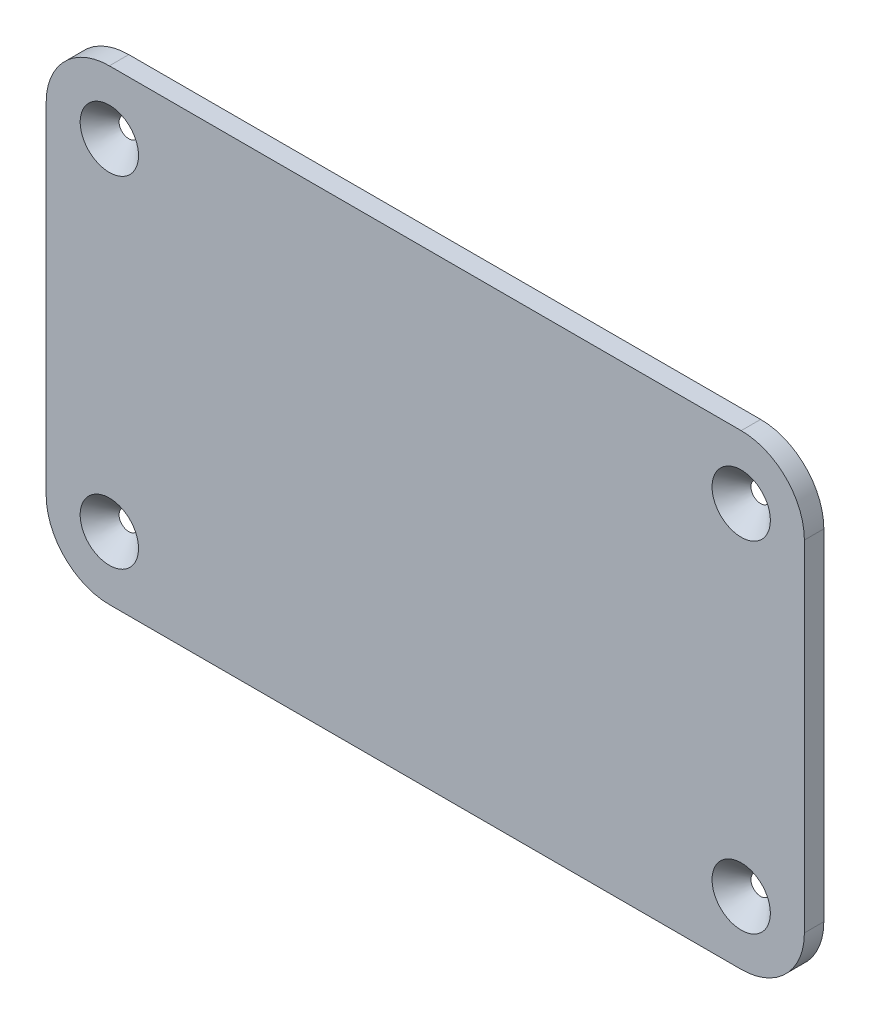
ISO-10303-21;
HEADER;
FILE_DESCRIPTION(('STEP AP214'),'2;1');
FILE_NAME('part.step','',(''),(''),'','','');
FILE_SCHEMA(('AUTOMOTIVE_DESIGN { 1 0 10303 214 1 1 1 1 }'));
ENDSEC;
DATA;
#1=APPLICATION_CONTEXT('core data for automotive mechanical design processes');
#2=APPLICATION_PROTOCOL_DEFINITION('international standard','automotive_design',2000,#1);
#3=PRODUCT_CONTEXT('',#1,'mechanical');
#4=PRODUCT('Part','Part','',(#3));
#5=PRODUCT_RELATED_PRODUCT_CATEGORY('part','',(#4));
#6=PRODUCT_DEFINITION_FORMATION('','',#4);
#7=PRODUCT_DEFINITION_CONTEXT('part definition',#1,'design');
#8=PRODUCT_DEFINITION('design','',#6,#7);
#9=PRODUCT_DEFINITION_SHAPE('','',#8);
#10=(LENGTH_UNIT() NAMED_UNIT(*) SI_UNIT(.MILLI.,.METRE.));
#11=(NAMED_UNIT(*) PLANE_ANGLE_UNIT() SI_UNIT($,.RADIAN.));
#12=(NAMED_UNIT(*) SI_UNIT($,.STERADIAN.) SOLID_ANGLE_UNIT());
#13=UNCERTAINTY_MEASURE_WITH_UNIT(LENGTH_MEASURE(1.E-05),#10,'distance_accuracy_value','');
#14=(GEOMETRIC_REPRESENTATION_CONTEXT(3) GLOBAL_UNCERTAINTY_ASSIGNED_CONTEXT((#13)) GLOBAL_UNIT_ASSIGNED_CONTEXT((#10,
#11,#12)) REPRESENTATION_CONTEXT('',''));
#15=CARTESIAN_POINT('',(0.,0.,0.));
#16=DIRECTION('',(0.,0.,1.));
#17=DIRECTION('',(1.,0.,0.));
#18=AXIS2_PLACEMENT_3D('',#15,#16,#17);
#19=CARTESIAN_POINT('',(0.,0.,4.));
#20=DIRECTION('',(0.,0.,1.));
#21=DIRECTION('',(1.,0.,0.));
#22=AXIS2_PLACEMENT_3D('',#19,#20,#21);
#23=PLANE('',#22);
#24=CARTESIAN_POINT('',(-32.5,17.5,4.));
#25=DIRECTION('',(0.,0.,1.));
#26=DIRECTION('',(1.,0.,0.));
#27=AXIS2_PLACEMENT_3D('',#24,#25,#26);
#28=CIRCLE('',#27,3.);
#29=CARTESIAN_POINT('',(-29.5,17.5,4.));
#30=VERTEX_POINT('',#29);
#31=EDGE_CURVE('E199',#30,#30,#28,.T.);
#32=ORIENTED_EDGE('',*,*,#31,.F.);
#33=EDGE_LOOP('',(#32));
#34=FACE_BOUND('',#33,.T.);
#35=CARTESIAN_POINT('',(-32.5,-17.5,4.));
#36=DIRECTION('',(0.,0.,1.));
#37=DIRECTION('',(1.,0.,0.));
#38=AXIS2_PLACEMENT_3D('',#35,#36,#37);
#39=CIRCLE('',#38,3.);
#40=CARTESIAN_POINT('',(-29.5,-17.5,4.));
#41=VERTEX_POINT('',#40);
#42=EDGE_CURVE('E203',#41,#41,#39,.T.);
#43=ORIENTED_EDGE('',*,*,#42,.F.);
#44=EDGE_LOOP('',(#43));
#45=FACE_BOUND('',#44,.T.);
#46=CARTESIAN_POINT('',(32.5,17.5,4.));
#47=DIRECTION('',(0.,0.,1.));
#48=DIRECTION('',(1.,0.,0.));
#49=AXIS2_PLACEMENT_3D('',#46,#47,#48);
#50=CIRCLE('',#49,3.);
#51=CARTESIAN_POINT('',(35.5,17.5,4.));
#52=VERTEX_POINT('',#51);
#53=EDGE_CURVE('E207',#52,#52,#50,.T.);
#54=ORIENTED_EDGE('',*,*,#53,.F.);
#55=EDGE_LOOP('',(#54));
#56=FACE_BOUND('',#55,.T.);
#57=CARTESIAN_POINT('',(32.5,-17.5,4.));
#58=DIRECTION('',(0.,0.,1.));
#59=DIRECTION('',(1.,0.,0.));
#60=AXIS2_PLACEMENT_3D('',#57,#58,#59);
#61=CIRCLE('',#60,3.);
#62=CARTESIAN_POINT('',(35.5,-17.5,4.));
#63=VERTEX_POINT('',#62);
#64=EDGE_CURVE('E210',#63,#63,#61,.T.);
#65=ORIENTED_EDGE('',*,*,#64,.F.);
#66=EDGE_LOOP('',(#65));
#67=FACE_BOUND('',#66,.T.);
#68=DIRECTION('',(1.,0.,0.));
#69=VECTOR('',#68,1.);
#70=CARTESIAN_POINT('',(-400000.,24.0000000000009,4.));
#71=LINE('',#70,#69);
#72=CARTESIAN_POINT('',(-32.5000000000273,24.0000000000009,4.));
#73=VERTEX_POINT('',#72);
#74=CARTESIAN_POINT('',(32.5000000000273,24.0000000000009,4.));
#75=VERTEX_POINT('',#74);
#76=EDGE_CURVE('E99',#73,#75,#71,.T.);
#77=ORIENTED_EDGE('',*,*,#76,.F.);
#78=CARTESIAN_POINT('',(-32.5,17.5,4.));
#79=DIRECTION('',(0.,0.,1.));
#80=DIRECTION('',(1.,0.,0.));
#81=AXIS2_PLACEMENT_3D('',#78,#79,#80);
#82=CIRCLE('',#81,6.5);
#83=CARTESIAN_POINT('',(-38.9999999999882,17.5000000000409,4.));
#84=VERTEX_POINT('',#83);
#85=EDGE_CURVE('E121',#73,#84,#82,.T.);
#86=ORIENTED_EDGE('',*,*,#85,.T.);
#87=DIRECTION('',(0.,1.,0.));
#88=VECTOR('',#87,1.);
#89=CARTESIAN_POINT('',(-38.9999999999304,-291545.,4.));
#90=LINE('',#89,#88);
#91=CARTESIAN_POINT('',(-39.,-17.4999999999841,4.));
#92=VERTEX_POINT('',#91);
#93=EDGE_CURVE('E125',#92,#84,#90,.T.);
#94=ORIENTED_EDGE('',*,*,#93,.F.);
#95=CARTESIAN_POINT('',(-32.5,-17.5,4.));
#96=DIRECTION('',(0.,0.,1.));
#97=DIRECTION('',(1.,0.,0.));
#98=AXIS2_PLACEMENT_3D('',#95,#96,#97);
#99=CIRCLE('',#98,6.5);
#100=CARTESIAN_POINT('',(-32.5000000000273,-23.9999999999937,4.));
#101=VERTEX_POINT('',#100);
#102=EDGE_CURVE('E123',#92,#101,#99,.T.);
#103=ORIENTED_EDGE('',*,*,#102,.T.);
#104=DIRECTION('',(-1.,0.,0.));
#105=VECTOR('',#104,1.);
#106=CARTESIAN_POINT('',(-400000.,-24.0000000000578,4.));
#107=LINE('',#106,#105);
#108=CARTESIAN_POINT('',(32.5000000000273,-24.,4.));
#109=VERTEX_POINT('',#108);
#110=EDGE_CURVE('E131',#109,#101,#107,.T.);
#111=ORIENTED_EDGE('',*,*,#110,.F.);
#112=CARTESIAN_POINT('',(32.5,-17.5,4.));
#113=DIRECTION('',(0.,0.,1.));
#114=DIRECTION('',(1.,0.,0.));
#115=AXIS2_PLACEMENT_3D('',#112,#113,#114);
#116=CIRCLE('',#115,6.5);
#117=CARTESIAN_POINT('',(38.9999999999854,-17.4999999999841,4.));
#118=VERTEX_POINT('',#117);
#119=EDGE_CURVE('E102',#109,#118,#116,.T.);
#120=ORIENTED_EDGE('',*,*,#119,.T.);
#121=DIRECTION('',(0.,-1.,0.));
#122=VECTOR('',#121,1.);
#123=CARTESIAN_POINT('',(39.000000000101,-291545.,4.));
#124=LINE('',#123,#122);
#125=CARTESIAN_POINT('',(39.,17.5,4.));
#126=VERTEX_POINT('',#125);
#127=EDGE_CURVE('E92',#126,#118,#124,.T.);
#128=ORIENTED_EDGE('',*,*,#127,.F.);
#129=CARTESIAN_POINT('',(32.5,17.5,4.));
#130=DIRECTION('',(0.,0.,1.));
#131=DIRECTION('',(1.,0.,0.));
#132=AXIS2_PLACEMENT_3D('',#129,#130,#131);
#133=CIRCLE('',#132,6.49999999999999);
#134=EDGE_CURVE('E96',#126,#75,#133,.T.);
#135=ORIENTED_EDGE('',*,*,#134,.T.);
#136=EDGE_LOOP('',(#77,#86,#94,#103,#111,#120,#128,#135));
#137=FACE_BOUND('',#136,.T.);
#138=ADVANCED_FACE('F32',(#34,#45,#56,#67,#137),#23,.T.);
#139=CARTESIAN_POINT('',(-32.5,17.5,2.));
#140=DIRECTION('',(0.,0.,1.));
#141=DIRECTION('',(1.,0.,0.));
#142=AXIS2_PLACEMENT_3D('',#139,#140,#141);
#143=PLANE('',#142);
#144=CARTESIAN_POINT('',(-32.5,17.5,2.));
#145=DIRECTION('',(0.,0.,1.));
#146=DIRECTION('',(1.,0.,0.));
#147=AXIS2_PLACEMENT_3D('',#144,#145,#146);
#148=CIRCLE('',#147,0.999999999999996);
#149=CARTESIAN_POINT('',(-31.5,17.5,2.));
#150=VERTEX_POINT('',#149);
#151=EDGE_CURVE('E219',#150,#150,#148,.T.);
#152=ORIENTED_EDGE('',*,*,#151,.T.);
#153=EDGE_LOOP('',(#152));
#154=FACE_BOUND('',#153,.T.);
#155=CARTESIAN_POINT('',(-32.5,-17.5,2.));
#156=DIRECTION('',(0.,0.,1.));
#157=DIRECTION('',(1.,0.,0.));
#158=AXIS2_PLACEMENT_3D('',#155,#156,#157);
#159=CIRCLE('',#158,0.999999999999996);
#160=CARTESIAN_POINT('',(-31.5,-17.5,2.));
#161=VERTEX_POINT('',#160);
#162=EDGE_CURVE('E35',#161,#161,#159,.T.);
#163=ORIENTED_EDGE('',*,*,#162,.T.);
#164=EDGE_LOOP('',(#163));
#165=FACE_BOUND('',#164,.T.);
#166=CARTESIAN_POINT('',(32.5,17.5,2.));
#167=DIRECTION('',(0.,0.,1.));
#168=DIRECTION('',(1.,0.,0.));
#169=AXIS2_PLACEMENT_3D('',#166,#167,#168);
#170=CIRCLE('',#169,0.999999999999996);
#171=CARTESIAN_POINT('',(33.5,17.5,2.));
#172=VERTEX_POINT('',#171);
#173=EDGE_CURVE('E211',#172,#172,#170,.T.);
#174=ORIENTED_EDGE('',*,*,#173,.T.);
#175=EDGE_LOOP('',(#174));
#176=FACE_BOUND('',#175,.T.);
#177=CARTESIAN_POINT('',(32.5,-17.5,2.));
#178=DIRECTION('',(0.,0.,1.));
#179=DIRECTION('',(1.,0.,0.));
#180=AXIS2_PLACEMENT_3D('',#177,#178,#179);
#181=CIRCLE('',#180,0.999999999999996);
#182=CARTESIAN_POINT('',(33.5,-17.5,2.));
#183=VERTEX_POINT('',#182);
#184=EDGE_CURVE('E124',#183,#183,#181,.T.);
#185=ORIENTED_EDGE('',*,*,#184,.T.);
#186=EDGE_LOOP('',(#185));
#187=FACE_BOUND('',#186,.T.);
#188=CARTESIAN_POINT('',(-32.5,17.5,2.));
#189=DIRECTION('',(0.,0.,1.));
#190=DIRECTION('',(1.,0.,0.));
#191=AXIS2_PLACEMENT_3D('',#188,#189,#190);
#192=CIRCLE('',#191,6.5);
#193=CARTESIAN_POINT('',(-32.5000000000273,24.0000000000009,2.));
#194=VERTEX_POINT('',#193);
#195=CARTESIAN_POINT('',(-38.9999999999882,17.5000000000409,2.));
#196=VERTEX_POINT('',#195);
#197=EDGE_CURVE('E11',#194,#196,#192,.T.);
#198=ORIENTED_EDGE('',*,*,#197,.F.);
#199=DIRECTION('',(1.,0.,0.));
#200=VECTOR('',#199,1.);
#201=CARTESIAN_POINT('',(-400000.,24.0000000000009,2.));
#202=LINE('',#201,#200);
#203=CARTESIAN_POINT('',(32.5000000000273,24.0000000000009,2.));
#204=VERTEX_POINT('',#203);
#205=EDGE_CURVE('E101',#194,#204,#202,.T.);
#206=ORIENTED_EDGE('',*,*,#205,.T.);
#207=CARTESIAN_POINT('',(32.5,17.5,2.));
#208=DIRECTION('',(0.,0.,1.));
#209=DIRECTION('',(1.,0.,0.));
#210=AXIS2_PLACEMENT_3D('',#207,#208,#209);
#211=CIRCLE('',#210,6.49999999999999);
#212=CARTESIAN_POINT('',(39.,17.4999999999841,2.));
#213=VERTEX_POINT('',#212);
#214=EDGE_CURVE('E108',#213,#204,#211,.T.);
#215=ORIENTED_EDGE('',*,*,#214,.F.);
#216=DIRECTION('',(0.,-1.,0.));
#217=VECTOR('',#216,1.);
#218=CARTESIAN_POINT('',(39.000000000101,-291545.,2.));
#219=LINE('',#218,#217);
#220=CARTESIAN_POINT('',(38.9999999999854,-17.4999999999841,2.));
#221=VERTEX_POINT('',#220);
#222=EDGE_CURVE('E150',#213,#221,#219,.T.);
#223=ORIENTED_EDGE('',*,*,#222,.T.);
#224=CARTESIAN_POINT('',(32.5,-17.5,2.));
#225=DIRECTION('',(0.,0.,1.));
#226=DIRECTION('',(1.,0.,0.));
#227=AXIS2_PLACEMENT_3D('',#224,#225,#226);
#228=CIRCLE('',#227,6.5);
#229=CARTESIAN_POINT('',(32.5000000000273,-24.,2.));
#230=VERTEX_POINT('',#229);
#231=EDGE_CURVE('E135',#230,#221,#228,.T.);
#232=ORIENTED_EDGE('',*,*,#231,.F.);
#233=DIRECTION('',(-1.,0.,0.));
#234=VECTOR('',#233,1.);
#235=CARTESIAN_POINT('',(-400000.,-24.0000000000578,2.));
#236=LINE('',#235,#234);
#237=CARTESIAN_POINT('',(-32.5000000000273,-23.9999999999937,2.));
#238=VERTEX_POINT('',#237);
#239=EDGE_CURVE('E118',#230,#238,#236,.T.);
#240=ORIENTED_EDGE('',*,*,#239,.T.);
#241=CARTESIAN_POINT('',(-32.5,-17.5,2.));
#242=DIRECTION('',(0.,0.,1.));
#243=DIRECTION('',(1.,0.,0.));
#244=AXIS2_PLACEMENT_3D('',#241,#242,#243);
#245=CIRCLE('',#244,6.5);
#246=CARTESIAN_POINT('',(-39.,-17.4999999999841,2.));
#247=VERTEX_POINT('',#246);
#248=EDGE_CURVE('E129',#247,#238,#245,.T.);
#249=ORIENTED_EDGE('',*,*,#248,.F.);
#250=DIRECTION('',(0.,1.,0.));
#251=VECTOR('',#250,1.);
#252=CARTESIAN_POINT('',(-38.9999999999304,-291545.,2.));
#253=LINE('',#252,#251);
#254=EDGE_CURVE('E115',#247,#196,#253,.T.);
#255=ORIENTED_EDGE('',*,*,#254,.T.);
#256=EDGE_LOOP('',(#198,#206,#215,#223,#232,#240,#249,#255));
#257=FACE_BOUND('',#256,.T.);
#258=ADVANCED_FACE('F168',(#154,#165,#176,#187,#257),#143,.F.);
#259=CARTESIAN_POINT('',(-400000.,24.0000000000009,95.586025134843));
#260=DIRECTION('',(0.,1.,0.));
#261=DIRECTION('',(0.,0.,1.));
#262=AXIS2_PLACEMENT_3D('',#259,#260,#261);
#263=PLANE('',#262);
#264=DIRECTION('',(0.,0.,-1.));
#265=VECTOR('',#264,1.);
#266=CARTESIAN_POINT('',(-32.5000000000273,24.0000000000009,95.586025134843));
#267=LINE('',#266,#265);
#268=EDGE_CURVE('E41',#73,#194,#267,.T.);
#269=ORIENTED_EDGE('',*,*,#268,.F.);
#270=ORIENTED_EDGE('',*,*,#76,.T.);
#271=DIRECTION('',(0.,0.,-1.));
#272=VECTOR('',#271,1.);
#273=CARTESIAN_POINT('',(32.5000000000273,24.0000000000009,95.586025134843));
#274=LINE('',#273,#272);
#275=EDGE_CURVE('E105',#75,#204,#274,.T.);
#276=ORIENTED_EDGE('',*,*,#275,.T.);
#277=ORIENTED_EDGE('',*,*,#205,.F.);
#278=EDGE_LOOP('',(#269,#270,#276,#277));
#279=FACE_BOUND('',#278,.T.);
#280=ADVANCED_FACE('F114',(#279),#263,.T.);
#281=CARTESIAN_POINT('',(32.5,17.5,95.586025134843));
#282=DIRECTION('',(0.,0.,-1.));
#283=DIRECTION('',(-1.,0.,0.));
#284=AXIS2_PLACEMENT_3D('',#281,#282,#283);
#285=CYLINDRICAL_SURFACE('',#284,6.49999999999999);
#286=ORIENTED_EDGE('',*,*,#134,.F.);
#287=DIRECTION('',(0.,0.,-1.));
#288=VECTOR('',#287,1.);
#289=CARTESIAN_POINT('',(39.,17.4999999999841,95.586025134843));
#290=LINE('',#289,#288);
#291=EDGE_CURVE('E112',#126,#213,#290,.T.);
#292=ORIENTED_EDGE('',*,*,#291,.T.);
#293=ORIENTED_EDGE('',*,*,#214,.T.);
#294=ORIENTED_EDGE('',*,*,#275,.F.);
#295=EDGE_LOOP('',(#286,#292,#293,#294));
#296=FACE_BOUND('',#295,.T.);
#297=ADVANCED_FACE('F106',(#296),#285,.T.);
#298=CARTESIAN_POINT('',(39.000000000101,-291545.,95.586025134843));
#299=DIRECTION('',(1.,0.,0.));
#300=DIRECTION('',(0.,1.,0.));
#301=AXIS2_PLACEMENT_3D('',#298,#299,#300);
#302=PLANE('',#301);
#303=ORIENTED_EDGE('',*,*,#291,.F.);
#304=ORIENTED_EDGE('',*,*,#127,.T.);
#305=DIRECTION('',(0.,0.,-1.));
#306=VECTOR('',#305,1.);
#307=CARTESIAN_POINT('',(38.9999999999854,-17.4999999999841,95.586025134843));
#308=LINE('',#307,#306);
#309=EDGE_CURVE('E137',#118,#221,#308,.T.);
#310=ORIENTED_EDGE('',*,*,#309,.T.);
#311=ORIENTED_EDGE('',*,*,#222,.F.);
#312=EDGE_LOOP('',(#303,#304,#310,#311));
#313=FACE_BOUND('',#312,.T.);
#314=ADVANCED_FACE('F273',(#313),#302,.T.);
#315=CARTESIAN_POINT('',(32.5,-17.5,95.586025134843));
#316=DIRECTION('',(0.,0.,-1.));
#317=DIRECTION('',(-1.,0.,0.));
#318=AXIS2_PLACEMENT_3D('',#315,#316,#317);
#319=CYLINDRICAL_SURFACE('',#318,6.5);
#320=ORIENTED_EDGE('',*,*,#119,.F.);
#321=DIRECTION('',(0.,0.,-1.));
#322=VECTOR('',#321,1.);
#323=CARTESIAN_POINT('',(32.5000000000273,-24.,95.586025134843));
#324=LINE('',#323,#322);
#325=EDGE_CURVE('E143',#109,#230,#324,.T.);
#326=ORIENTED_EDGE('',*,*,#325,.T.);
#327=ORIENTED_EDGE('',*,*,#231,.T.);
#328=ORIENTED_EDGE('',*,*,#309,.F.);
#329=EDGE_LOOP('',(#320,#326,#327,#328));
#330=FACE_BOUND('',#329,.T.);
#331=ADVANCED_FACE('F282',(#330),#319,.T.);
#332=CARTESIAN_POINT('',(-400000.,-24.0000000000578,95.586025134843));
#333=DIRECTION('',(0.,-1.,0.));
#334=DIRECTION('',(1.,0.,0.));
#335=AXIS2_PLACEMENT_3D('',#332,#333,#334);
#336=PLANE('',#335);
#337=ORIENTED_EDGE('',*,*,#325,.F.);
#338=ORIENTED_EDGE('',*,*,#110,.T.);
#339=DIRECTION('',(0.,0.,-1.));
#340=VECTOR('',#339,1.);
#341=CARTESIAN_POINT('',(-32.5000000000273,-23.9999999999937,95.586025134843));
#342=LINE('',#341,#340);
#343=EDGE_CURVE('E134',#101,#238,#342,.T.);
#344=ORIENTED_EDGE('',*,*,#343,.T.);
#345=ORIENTED_EDGE('',*,*,#239,.F.);
#346=EDGE_LOOP('',(#337,#338,#344,#345));
#347=FACE_BOUND('',#346,.T.);
#348=ADVANCED_FACE('F171',(#347),#336,.T.);
#349=CARTESIAN_POINT('',(-32.5,-17.5,95.586025134843));
#350=DIRECTION('',(0.,0.,-1.));
#351=DIRECTION('',(-1.,0.,0.));
#352=AXIS2_PLACEMENT_3D('',#349,#350,#351);
#353=CYLINDRICAL_SURFACE('',#352,6.5);
#354=ORIENTED_EDGE('',*,*,#102,.F.);
#355=DIRECTION('',(0.,0.,-1.));
#356=VECTOR('',#355,1.);
#357=CARTESIAN_POINT('',(-39.,-17.4999999999841,95.586025134843));
#358=LINE('',#357,#356);
#359=EDGE_CURVE('E140',#92,#247,#358,.T.);
#360=ORIENTED_EDGE('',*,*,#359,.T.);
#361=ORIENTED_EDGE('',*,*,#248,.T.);
#362=ORIENTED_EDGE('',*,*,#343,.F.);
#363=EDGE_LOOP('',(#354,#360,#361,#362));
#364=FACE_BOUND('',#363,.T.);
#365=ADVANCED_FACE('F162',(#364),#353,.T.);
#366=CARTESIAN_POINT('',(-38.9999999999304,-291545.,95.586025134843));
#367=DIRECTION('',(-1.,0.,0.));
#368=DIRECTION('',(0.,-1.,0.));
#369=AXIS2_PLACEMENT_3D('',#366,#367,#368);
#370=PLANE('',#369);
#371=ORIENTED_EDGE('',*,*,#359,.F.);
#372=ORIENTED_EDGE('',*,*,#93,.T.);
#373=DIRECTION('',(0.,0.,-1.));
#374=VECTOR('',#373,1.);
#375=CARTESIAN_POINT('',(-38.9999999999882,17.5000000000409,95.586025134843));
#376=LINE('',#375,#374);
#377=EDGE_CURVE('E128',#84,#196,#376,.T.);
#378=ORIENTED_EDGE('',*,*,#377,.T.);
#379=ORIENTED_EDGE('',*,*,#254,.F.);
#380=EDGE_LOOP('',(#371,#372,#378,#379));
#381=FACE_BOUND('',#380,.T.);
#382=ADVANCED_FACE('F176',(#381),#370,.T.);
#383=CARTESIAN_POINT('',(-32.5,17.5,95.586025134843));
#384=DIRECTION('',(0.,0.,-1.));
#385=DIRECTION('',(-1.,0.,0.));
#386=AXIS2_PLACEMENT_3D('',#383,#384,#385);
#387=CYLINDRICAL_SURFACE('',#386,6.5);
#388=ORIENTED_EDGE('',*,*,#85,.F.);
#389=ORIENTED_EDGE('',*,*,#268,.T.);
#390=ORIENTED_EDGE('',*,*,#197,.T.);
#391=ORIENTED_EDGE('',*,*,#377,.F.);
#392=EDGE_LOOP('',(#388,#389,#390,#391));
#393=FACE_BOUND('',#392,.T.);
#394=ADVANCED_FACE('F177',(#393),#387,.T.);
#395=CARTESIAN_POINT('',(32.5,-17.5,4.));
#396=DIRECTION('',(0.,0.,1.));
#397=DIRECTION('',(1.,0.,0.));
#398=AXIS2_PLACEMENT_3D('',#395,#396,#397);
#399=CONICAL_SURFACE('',#398,3.,0.78539816339745);
#400=CARTESIAN_POINT('',(35.5,-17.5,4.));
#401=CARTESIAN_POINT('',(35.4791666666667,-17.5,3.97916666666667));
#402=CARTESIAN_POINT('',(35.4583333333333,-17.5,3.95833333333333));
#403=CARTESIAN_POINT('',(35.4166666666667,-17.5,3.91666666666667));
#404=CARTESIAN_POINT('',(35.3958333333333,-17.5,3.89583333333333));
#405=CARTESIAN_POINT('',(35.3541666666667,-17.5,3.85416666666667));
#406=CARTESIAN_POINT('',(35.3333333333333,-17.5,3.83333333333333));
#407=CARTESIAN_POINT('',(35.2916666666667,-17.5,3.79166666666667));
#408=CARTESIAN_POINT('',(35.2708333333333,-17.5,3.77083333333333));
#409=CARTESIAN_POINT('',(35.2291666666667,-17.5,3.72916666666667));
#410=CARTESIAN_POINT('',(35.2083333333333,-17.5,3.70833333333333));
#411=CARTESIAN_POINT('',(35.1666666666667,-17.5,3.66666666666667));
#412=CARTESIAN_POINT('',(35.1458333333333,-17.5,3.64583333333333));
#413=CARTESIAN_POINT('',(35.1041666666667,-17.5,3.60416666666667));
#414=CARTESIAN_POINT('',(35.0833333333333,-17.5,3.58333333333333));
#415=CARTESIAN_POINT('',(35.0416666666667,-17.5,3.54166666666667));
#416=CARTESIAN_POINT('',(35.0208333333333,-17.5,3.52083333333333));
#417=CARTESIAN_POINT('',(34.9791666666667,-17.5,3.47916666666667));
#418=CARTESIAN_POINT('',(34.9583333333333,-17.5,3.45833333333333));
#419=CARTESIAN_POINT('',(34.9166666666667,-17.5,3.41666666666667));
#420=CARTESIAN_POINT('',(34.8958333333333,-17.5,3.39583333333333));
#421=CARTESIAN_POINT('',(34.8541666666667,-17.5,3.35416666666667));
#422=CARTESIAN_POINT('',(34.8333333333333,-17.5,3.33333333333333));
#423=CARTESIAN_POINT('',(34.7916666666667,-17.5,3.29166666666667));
#424=CARTESIAN_POINT('',(34.7708333333333,-17.5,3.27083333333333));
#425=CARTESIAN_POINT('',(34.7291666666667,-17.5,3.22916666666667));
#426=CARTESIAN_POINT('',(34.7083333333333,-17.5,3.20833333333333));
#427=CARTESIAN_POINT('',(34.6666666666667,-17.5,3.16666666666667));
#428=CARTESIAN_POINT('',(34.6458333333333,-17.5,3.14583333333333));
#429=CARTESIAN_POINT('',(34.6041666666667,-17.5,3.10416666666667));
#430=CARTESIAN_POINT('',(34.5833333333333,-17.5,3.08333333333333));
#431=CARTESIAN_POINT('',(34.5416666666667,-17.5,3.04166666666667));
#432=CARTESIAN_POINT('',(34.5208333333333,-17.5,3.02083333333333));
#433=CARTESIAN_POINT('',(34.4791666666667,-17.5,2.97916666666667));
#434=CARTESIAN_POINT('',(34.4583333333333,-17.5,2.95833333333333));
#435=CARTESIAN_POINT('',(34.4166666666667,-17.5,2.91666666666667));
#436=CARTESIAN_POINT('',(34.3958333333333,-17.5,2.89583333333333));
#437=CARTESIAN_POINT('',(34.3541666666667,-17.5,2.85416666666667));
#438=CARTESIAN_POINT('',(34.3333333333333,-17.5,2.83333333333333));
#439=CARTESIAN_POINT('',(34.2916666666667,-17.5,2.79166666666667));
#440=CARTESIAN_POINT('',(34.2708333333333,-17.5,2.77083333333333));
#441=CARTESIAN_POINT('',(34.2291666666667,-17.5,2.72916666666667));
#442=CARTESIAN_POINT('',(34.2083333333333,-17.5,2.70833333333333));
#443=CARTESIAN_POINT('',(34.1666666666667,-17.5,2.66666666666667));
#444=CARTESIAN_POINT('',(34.1458333333333,-17.5,2.64583333333333));
#445=CARTESIAN_POINT('',(34.1041666666667,-17.5,2.60416666666667));
#446=CARTESIAN_POINT('',(34.0833333333333,-17.5,2.58333333333333));
#447=CARTESIAN_POINT('',(34.0416666666667,-17.5,2.54166666666667));
#448=CARTESIAN_POINT('',(34.0208333333333,-17.5,2.52083333333333));
#449=CARTESIAN_POINT('',(33.9791666666667,-17.5,2.47916666666667));
#450=CARTESIAN_POINT('',(33.9583333333333,-17.5,2.45833333333333));
#451=CARTESIAN_POINT('',(33.9166666666667,-17.5,2.41666666666667));
#452=CARTESIAN_POINT('',(33.8958333333333,-17.5,2.39583333333333));
#453=CARTESIAN_POINT('',(33.8541666666667,-17.5,2.35416666666667));
#454=CARTESIAN_POINT('',(33.8333333333333,-17.5,2.33333333333333));
#455=CARTESIAN_POINT('',(33.7916666666667,-17.5,2.29166666666667));
#456=CARTESIAN_POINT('',(33.7708333333333,-17.5,2.27083333333333));
#457=CARTESIAN_POINT('',(33.7291666666667,-17.5,2.22916666666667));
#458=CARTESIAN_POINT('',(33.7083333333333,-17.5,2.20833333333333));
#459=CARTESIAN_POINT('',(33.6666666666667,-17.5,2.16666666666667));
#460=CARTESIAN_POINT('',(33.6458333333333,-17.5,2.14583333333333));
#461=CARTESIAN_POINT('',(33.6041666666667,-17.5,2.10416666666667));
#462=CARTESIAN_POINT('',(33.5833333333333,-17.5,2.08333333333333));
#463=CARTESIAN_POINT('',(33.5416666666667,-17.5,2.04166666666667));
#464=CARTESIAN_POINT('',(33.5208333333333,-17.5,2.02083333333333));
#465=CARTESIAN_POINT('',(33.5,-17.5,2.));
#466=B_SPLINE_CURVE_WITH_KNOTS('',3,(#400,#401,#402,#403,#404,#405,#406,#407,#408,#409,#410,
#411,#412,#413,#414,#415,#416,#417,#418,#419,#420,#421,#422,#423,#424,#425,#426,#427,#428,#429,
#430,#431,#432,#433,#434,#435,#436,#437,#438,#439,#440,#441,#442,#443,#444,#445,#446,#447,#448,
#449,#450,#451,#452,#453,#454,#455,#456,#457,#458,#459,#460,#461,#462,#463,#464,#465),
.UNSPECIFIED.,.F.,.F.,(4,2,2,2,2,2,2,2,2,2,2,2,2,2,2,2,2,2,2,2,2,2,2,2,2,2,2,2,2,2,2,2,4),(0.,
0.0883883476483185,0.176776695296637,0.265165042944956,0.353553390593274,0.441941738241593,
0.530330085889911,0.61871843353823,0.707106781186548,0.795495128834867,0.883883476483185,
0.972271824131504,1.06066017177982,1.14904851942814,1.23743686707646,1.32582521472478,
1.4142135623731,1.50260191002141,1.59099025766973,1.67937860531805,1.76776695296637,
1.85615530061469,1.94454364826301,2.03293199591133,2.12132034355965,2.20970869120797,
2.29809703885629,2.3864853865046,2.47487373415292,2.56326208180124,2.65165042944956,
2.74003877709788,2.8284271247462),.UNSPECIFIED.);
#467=EDGE_CURVE('BSEAM179',#63,#183,#466,.T.);
#468=ORIENTED_EDGE('',*,*,#64,.T.);
#469=ORIENTED_EDGE('',*,*,#184,.F.);
#470=ORIENTED_EDGE('',*,*,#467,.T.);
#471=ORIENTED_EDGE('',*,*,#467,.F.);
#472=EDGE_LOOP('',(#468,#470,#469,#471));
#473=FACE_BOUND('',#472,.T.);
#474=ADVANCED_FACE('F179',(#473),#399,.F.);
#475=CARTESIAN_POINT('',(32.5,17.5,4.));
#476=DIRECTION('',(0.,0.,1.));
#477=DIRECTION('',(1.,0.,0.));
#478=AXIS2_PLACEMENT_3D('',#475,#476,#477);
#479=CONICAL_SURFACE('',#478,3.,0.78539816339745);
#480=CARTESIAN_POINT('',(35.5,17.5,4.));
#481=CARTESIAN_POINT('',(35.4791666666667,17.5,3.97916666666667));
#482=CARTESIAN_POINT('',(35.4583333333333,17.5,3.95833333333333));
#483=CARTESIAN_POINT('',(35.4166666666667,17.5,3.91666666666667));
#484=CARTESIAN_POINT('',(35.3958333333333,17.5,3.89583333333333));
#485=CARTESIAN_POINT('',(35.3541666666667,17.5,3.85416666666667));
#486=CARTESIAN_POINT('',(35.3333333333333,17.5,3.83333333333333));
#487=CARTESIAN_POINT('',(35.2916666666667,17.5,3.79166666666667));
#488=CARTESIAN_POINT('',(35.2708333333333,17.5,3.77083333333333));
#489=CARTESIAN_POINT('',(35.2291666666667,17.5,3.72916666666667));
#490=CARTESIAN_POINT('',(35.2083333333333,17.5,3.70833333333333));
#491=CARTESIAN_POINT('',(35.1666666666667,17.5,3.66666666666667));
#492=CARTESIAN_POINT('',(35.1458333333333,17.5,3.64583333333333));
#493=CARTESIAN_POINT('',(35.1041666666667,17.5,3.60416666666667));
#494=CARTESIAN_POINT('',(35.0833333333333,17.5,3.58333333333333));
#495=CARTESIAN_POINT('',(35.0416666666667,17.5,3.54166666666667));
#496=CARTESIAN_POINT('',(35.0208333333333,17.5,3.52083333333333));
#497=CARTESIAN_POINT('',(34.9791666666667,17.5,3.47916666666667));
#498=CARTESIAN_POINT('',(34.9583333333333,17.5,3.45833333333333));
#499=CARTESIAN_POINT('',(34.9166666666667,17.5,3.41666666666667));
#500=CARTESIAN_POINT('',(34.8958333333333,17.5,3.39583333333333));
#501=CARTESIAN_POINT('',(34.8541666666667,17.5,3.35416666666667));
#502=CARTESIAN_POINT('',(34.8333333333333,17.5,3.33333333333333));
#503=CARTESIAN_POINT('',(34.7916666666667,17.5,3.29166666666667));
#504=CARTESIAN_POINT('',(34.7708333333333,17.5,3.27083333333333));
#505=CARTESIAN_POINT('',(34.7291666666667,17.5,3.22916666666667));
#506=CARTESIAN_POINT('',(34.7083333333333,17.5,3.20833333333333));
#507=CARTESIAN_POINT('',(34.6666666666667,17.5,3.16666666666667));
#508=CARTESIAN_POINT('',(34.6458333333333,17.5,3.14583333333333));
#509=CARTESIAN_POINT('',(34.6041666666667,17.5,3.10416666666667));
#510=CARTESIAN_POINT('',(34.5833333333333,17.5,3.08333333333333));
#511=CARTESIAN_POINT('',(34.5416666666667,17.5,3.04166666666667));
#512=CARTESIAN_POINT('',(34.5208333333333,17.5,3.02083333333333));
#513=CARTESIAN_POINT('',(34.4791666666667,17.5,2.97916666666667));
#514=CARTESIAN_POINT('',(34.4583333333333,17.5,2.95833333333333));
#515=CARTESIAN_POINT('',(34.4166666666667,17.5,2.91666666666667));
#516=CARTESIAN_POINT('',(34.3958333333333,17.5,2.89583333333333));
#517=CARTESIAN_POINT('',(34.3541666666667,17.5,2.85416666666667));
#518=CARTESIAN_POINT('',(34.3333333333333,17.5,2.83333333333333));
#519=CARTESIAN_POINT('',(34.2916666666667,17.5,2.79166666666667));
#520=CARTESIAN_POINT('',(34.2708333333333,17.5,2.77083333333333));
#521=CARTESIAN_POINT('',(34.2291666666667,17.5,2.72916666666667));
#522=CARTESIAN_POINT('',(34.2083333333333,17.5,2.70833333333333));
#523=CARTESIAN_POINT('',(34.1666666666667,17.5,2.66666666666667));
#524=CARTESIAN_POINT('',(34.1458333333333,17.5,2.64583333333333));
#525=CARTESIAN_POINT('',(34.1041666666667,17.5,2.60416666666667));
#526=CARTESIAN_POINT('',(34.0833333333333,17.5,2.58333333333333));
#527=CARTESIAN_POINT('',(34.0416666666667,17.5,2.54166666666667));
#528=CARTESIAN_POINT('',(34.0208333333333,17.5,2.52083333333333));
#529=CARTESIAN_POINT('',(33.9791666666667,17.5,2.47916666666667));
#530=CARTESIAN_POINT('',(33.9583333333333,17.5,2.45833333333333));
#531=CARTESIAN_POINT('',(33.9166666666667,17.5,2.41666666666667));
#532=CARTESIAN_POINT('',(33.8958333333333,17.5,2.39583333333333));
#533=CARTESIAN_POINT('',(33.8541666666667,17.5,2.35416666666667));
#534=CARTESIAN_POINT('',(33.8333333333333,17.5,2.33333333333333));
#535=CARTESIAN_POINT('',(33.7916666666667,17.5,2.29166666666667));
#536=CARTESIAN_POINT('',(33.7708333333333,17.5,2.27083333333333));
#537=CARTESIAN_POINT('',(33.7291666666667,17.5,2.22916666666667));
#538=CARTESIAN_POINT('',(33.7083333333333,17.5,2.20833333333333));
#539=CARTESIAN_POINT('',(33.6666666666667,17.5,2.16666666666667));
#540=CARTESIAN_POINT('',(33.6458333333333,17.5,2.14583333333333));
#541=CARTESIAN_POINT('',(33.6041666666667,17.5,2.10416666666667));
#542=CARTESIAN_POINT('',(33.5833333333333,17.5,2.08333333333333));
#543=CARTESIAN_POINT('',(33.5416666666667,17.5,2.04166666666667));
#544=CARTESIAN_POINT('',(33.5208333333333,17.5,2.02083333333333));
#545=CARTESIAN_POINT('',(33.5,17.5,2.));
#546=B_SPLINE_CURVE_WITH_KNOTS('',3,(#480,#481,#482,#483,#484,#485,#486,#487,#488,#489,#490,
#491,#492,#493,#494,#495,#496,#497,#498,#499,#500,#501,#502,#503,#504,#505,#506,#507,#508,#509,
#510,#511,#512,#513,#514,#515,#516,#517,#518,#519,#520,#521,#522,#523,#524,#525,#526,#527,#528,
#529,#530,#531,#532,#533,#534,#535,#536,#537,#538,#539,#540,#541,#542,#543,#544,#545),
.UNSPECIFIED.,.F.,.F.,(4,2,2,2,2,2,2,2,2,2,2,2,2,2,2,2,2,2,2,2,2,2,2,2,2,2,2,2,2,2,2,2,4),(0.,
0.0883883476483185,0.176776695296637,0.265165042944956,0.353553390593274,0.441941738241593,
0.530330085889911,0.61871843353823,0.707106781186548,0.795495128834867,0.883883476483185,
0.972271824131504,1.06066017177982,1.14904851942814,1.23743686707646,1.32582521472478,
1.4142135623731,1.50260191002141,1.59099025766973,1.67937860531805,1.76776695296637,
1.85615530061469,1.94454364826301,2.03293199591133,2.12132034355965,2.20970869120797,
2.29809703885629,2.3864853865046,2.47487373415292,2.56326208180124,2.65165042944956,
2.74003877709788,2.8284271247462),.UNSPECIFIED.);
#547=EDGE_CURVE('BSEAM185',#52,#172,#546,.T.);
#548=ORIENTED_EDGE('',*,*,#53,.T.);
#549=ORIENTED_EDGE('',*,*,#173,.F.);
#550=ORIENTED_EDGE('',*,*,#547,.T.);
#551=ORIENTED_EDGE('',*,*,#547,.F.);
#552=EDGE_LOOP('',(#548,#550,#549,#551));
#553=FACE_BOUND('',#552,.T.);
#554=ADVANCED_FACE('F185',(#553),#479,.F.);
#555=CARTESIAN_POINT('',(-32.5,-17.5,4.));
#556=DIRECTION('',(0.,0.,1.));
#557=DIRECTION('',(1.,0.,0.));
#558=AXIS2_PLACEMENT_3D('',#555,#556,#557);
#559=CONICAL_SURFACE('',#558,3.,0.785398163397449);
#560=CARTESIAN_POINT('',(-29.5,-17.5,4.));
#561=CARTESIAN_POINT('',(-29.5208333333333,-17.5,3.97916666666667));
#562=CARTESIAN_POINT('',(-29.5416666666667,-17.5,3.95833333333333));
#563=CARTESIAN_POINT('',(-29.5833333333333,-17.5,3.91666666666667));
#564=CARTESIAN_POINT('',(-29.6041666666667,-17.5,3.89583333333333));
#565=CARTESIAN_POINT('',(-29.6458333333333,-17.5,3.85416666666667));
#566=CARTESIAN_POINT('',(-29.6666666666667,-17.5,3.83333333333333));
#567=CARTESIAN_POINT('',(-29.7083333333333,-17.5,3.79166666666667));
#568=CARTESIAN_POINT('',(-29.7291666666667,-17.5,3.77083333333333));
#569=CARTESIAN_POINT('',(-29.7708333333333,-17.5,3.72916666666667));
#570=CARTESIAN_POINT('',(-29.7916666666667,-17.5,3.70833333333333));
#571=CARTESIAN_POINT('',(-29.8333333333333,-17.5,3.66666666666667));
#572=CARTESIAN_POINT('',(-29.8541666666667,-17.5,3.64583333333333));
#573=CARTESIAN_POINT('',(-29.8958333333333,-17.5,3.60416666666667));
#574=CARTESIAN_POINT('',(-29.9166666666667,-17.5,3.58333333333333));
#575=CARTESIAN_POINT('',(-29.9583333333333,-17.5,3.54166666666667));
#576=CARTESIAN_POINT('',(-29.9791666666667,-17.5,3.52083333333333));
#577=CARTESIAN_POINT('',(-30.0208333333333,-17.5,3.47916666666667));
#578=CARTESIAN_POINT('',(-30.0416666666667,-17.5,3.45833333333333));
#579=CARTESIAN_POINT('',(-30.0833333333333,-17.5,3.41666666666667));
#580=CARTESIAN_POINT('',(-30.1041666666667,-17.5,3.39583333333333));
#581=CARTESIAN_POINT('',(-30.1458333333333,-17.5,3.35416666666667));
#582=CARTESIAN_POINT('',(-30.1666666666667,-17.5,3.33333333333333));
#583=CARTESIAN_POINT('',(-30.2083333333333,-17.5,3.29166666666667));
#584=CARTESIAN_POINT('',(-30.2291666666667,-17.5,3.27083333333333));
#585=CARTESIAN_POINT('',(-30.2708333333333,-17.5,3.22916666666667));
#586=CARTESIAN_POINT('',(-30.2916666666667,-17.5,3.20833333333333));
#587=CARTESIAN_POINT('',(-30.3333333333333,-17.5,3.16666666666667));
#588=CARTESIAN_POINT('',(-30.3541666666667,-17.5,3.14583333333333));
#589=CARTESIAN_POINT('',(-30.3958333333333,-17.5,3.10416666666667));
#590=CARTESIAN_POINT('',(-30.4166666666667,-17.5,3.08333333333333));
#591=CARTESIAN_POINT('',(-30.4583333333333,-17.5,3.04166666666667));
#592=CARTESIAN_POINT('',(-30.4791666666667,-17.5,3.02083333333333));
#593=CARTESIAN_POINT('',(-30.5208333333333,-17.5,2.97916666666667));
#594=CARTESIAN_POINT('',(-30.5416666666667,-17.5,2.95833333333333));
#595=CARTESIAN_POINT('',(-30.5833333333333,-17.5,2.91666666666667));
#596=CARTESIAN_POINT('',(-30.6041666666667,-17.5,2.89583333333333));
#597=CARTESIAN_POINT('',(-30.6458333333333,-17.5,2.85416666666667));
#598=CARTESIAN_POINT('',(-30.6666666666667,-17.5,2.83333333333333));
#599=CARTESIAN_POINT('',(-30.7083333333333,-17.5,2.79166666666667));
#600=CARTESIAN_POINT('',(-30.7291666666667,-17.5,2.77083333333333));
#601=CARTESIAN_POINT('',(-30.7708333333333,-17.5,2.72916666666667));
#602=CARTESIAN_POINT('',(-30.7916666666667,-17.5,2.70833333333333));
#603=CARTESIAN_POINT('',(-30.8333333333333,-17.5,2.66666666666667));
#604=CARTESIAN_POINT('',(-30.8541666666667,-17.5,2.64583333333333));
#605=CARTESIAN_POINT('',(-30.8958333333333,-17.5,2.60416666666667));
#606=CARTESIAN_POINT('',(-30.9166666666667,-17.5,2.58333333333333));
#607=CARTESIAN_POINT('',(-30.9583333333333,-17.5,2.54166666666667));
#608=CARTESIAN_POINT('',(-30.9791666666667,-17.5,2.52083333333333));
#609=CARTESIAN_POINT('',(-31.0208333333333,-17.5,2.47916666666667));
#610=CARTESIAN_POINT('',(-31.0416666666667,-17.5,2.45833333333333));
#611=CARTESIAN_POINT('',(-31.0833333333333,-17.5,2.41666666666667));
#612=CARTESIAN_POINT('',(-31.1041666666667,-17.5,2.39583333333333));
#613=CARTESIAN_POINT('',(-31.1458333333333,-17.5,2.35416666666667));
#614=CARTESIAN_POINT('',(-31.1666666666667,-17.5,2.33333333333333));
#615=CARTESIAN_POINT('',(-31.2083333333333,-17.5,2.29166666666667));
#616=CARTESIAN_POINT('',(-31.2291666666667,-17.5,2.27083333333333));
#617=CARTESIAN_POINT('',(-31.2708333333333,-17.5,2.22916666666667));
#618=CARTESIAN_POINT('',(-31.2916666666667,-17.5,2.20833333333333));
#619=CARTESIAN_POINT('',(-31.3333333333333,-17.5,2.16666666666667));
#620=CARTESIAN_POINT('',(-31.3541666666667,-17.5,2.14583333333333));
#621=CARTESIAN_POINT('',(-31.3958333333333,-17.5,2.10416666666667));
#622=CARTESIAN_POINT('',(-31.4166666666667,-17.5,2.08333333333333));
#623=CARTESIAN_POINT('',(-31.4583333333333,-17.5,2.04166666666667));
#624=CARTESIAN_POINT('',(-31.4791666666667,-17.5,2.02083333333333));
#625=CARTESIAN_POINT('',(-31.5,-17.5,2.));
#626=B_SPLINE_CURVE_WITH_KNOTS('',3,(#560,#561,#562,#563,#564,#565,#566,#567,#568,#569,#570,
#571,#572,#573,#574,#575,#576,#577,#578,#579,#580,#581,#582,#583,#584,#585,#586,#587,#588,#589,
#590,#591,#592,#593,#594,#595,#596,#597,#598,#599,#600,#601,#602,#603,#604,#605,#606,#607,#608,
#609,#610,#611,#612,#613,#614,#615,#616,#617,#618,#619,#620,#621,#622,#623,#624,#625),
.UNSPECIFIED.,.F.,.F.,(4,2,2,2,2,2,2,2,2,2,2,2,2,2,2,2,2,2,2,2,2,2,2,2,2,2,2,2,2,2,2,2,4),(0.,
0.0883883476483179,0.176776695296637,0.265165042944955,0.353553390593273,0.441941738241592,
0.53033008588991,0.618718433538229,0.707106781186548,0.795495128834866,0.883883476483185,
0.972271824131503,1.06066017177982,1.14904851942814,1.23743686707646,1.32582521472478,
1.4142135623731,1.50260191002141,1.59099025766973,1.67937860531805,1.76776695296637,
1.85615530061469,1.94454364826301,2.03293199591133,2.12132034355964,2.20970869120796,
2.29809703885628,2.3864853865046,2.47487373415292,2.56326208180124,2.65165042944956,
2.74003877709788,2.82842712474619),.UNSPECIFIED.);
#627=EDGE_CURVE('BSEAM226',#41,#161,#626,.T.);
#628=ORIENTED_EDGE('',*,*,#42,.T.);
#629=ORIENTED_EDGE('',*,*,#162,.F.);
#630=ORIENTED_EDGE('',*,*,#627,.T.);
#631=ORIENTED_EDGE('',*,*,#627,.F.);
#632=EDGE_LOOP('',(#628,#630,#629,#631));
#633=FACE_BOUND('',#632,.T.);
#634=ADVANCED_FACE('F226',(#633),#559,.F.);
#635=CARTESIAN_POINT('',(-32.5,17.5,4.));
#636=DIRECTION('',(0.,0.,1.));
#637=DIRECTION('',(1.,0.,0.));
#638=AXIS2_PLACEMENT_3D('',#635,#636,#637);
#639=CONICAL_SURFACE('',#638,3.,0.785398163397449);
#640=CARTESIAN_POINT('',(-29.5,17.5,4.));
#641=CARTESIAN_POINT('',(-29.5208333333333,17.5,3.97916666666667));
#642=CARTESIAN_POINT('',(-29.5416666666667,17.5,3.95833333333333));
#643=CARTESIAN_POINT('',(-29.5833333333333,17.5,3.91666666666667));
#644=CARTESIAN_POINT('',(-29.6041666666667,17.5,3.89583333333333));
#645=CARTESIAN_POINT('',(-29.6458333333333,17.5,3.85416666666667));
#646=CARTESIAN_POINT('',(-29.6666666666667,17.5,3.83333333333333));
#647=CARTESIAN_POINT('',(-29.7083333333333,17.5,3.79166666666667));
#648=CARTESIAN_POINT('',(-29.7291666666667,17.5,3.77083333333333));
#649=CARTESIAN_POINT('',(-29.7708333333333,17.5,3.72916666666667));
#650=CARTESIAN_POINT('',(-29.7916666666667,17.5,3.70833333333333));
#651=CARTESIAN_POINT('',(-29.8333333333333,17.5,3.66666666666667));
#652=CARTESIAN_POINT('',(-29.8541666666667,17.5,3.64583333333333));
#653=CARTESIAN_POINT('',(-29.8958333333333,17.5,3.60416666666667));
#654=CARTESIAN_POINT('',(-29.9166666666667,17.5,3.58333333333333));
#655=CARTESIAN_POINT('',(-29.9583333333333,17.5,3.54166666666667));
#656=CARTESIAN_POINT('',(-29.9791666666667,17.5,3.52083333333333));
#657=CARTESIAN_POINT('',(-30.0208333333333,17.5,3.47916666666667));
#658=CARTESIAN_POINT('',(-30.0416666666667,17.5,3.45833333333333));
#659=CARTESIAN_POINT('',(-30.0833333333333,17.5,3.41666666666667));
#660=CARTESIAN_POINT('',(-30.1041666666667,17.5,3.39583333333333));
#661=CARTESIAN_POINT('',(-30.1458333333333,17.5,3.35416666666667));
#662=CARTESIAN_POINT('',(-30.1666666666667,17.5,3.33333333333333));
#663=CARTESIAN_POINT('',(-30.2083333333333,17.5,3.29166666666667));
#664=CARTESIAN_POINT('',(-30.2291666666667,17.5,3.27083333333333));
#665=CARTESIAN_POINT('',(-30.2708333333333,17.5,3.22916666666667));
#666=CARTESIAN_POINT('',(-30.2916666666667,17.5,3.20833333333333));
#667=CARTESIAN_POINT('',(-30.3333333333333,17.5,3.16666666666667));
#668=CARTESIAN_POINT('',(-30.3541666666667,17.5,3.14583333333333));
#669=CARTESIAN_POINT('',(-30.3958333333333,17.5,3.10416666666667));
#670=CARTESIAN_POINT('',(-30.4166666666667,17.5,3.08333333333333));
#671=CARTESIAN_POINT('',(-30.4583333333333,17.5,3.04166666666667));
#672=CARTESIAN_POINT('',(-30.4791666666667,17.5,3.02083333333333));
#673=CARTESIAN_POINT('',(-30.5208333333333,17.5,2.97916666666667));
#674=CARTESIAN_POINT('',(-30.5416666666667,17.5,2.95833333333333));
#675=CARTESIAN_POINT('',(-30.5833333333333,17.5,2.91666666666667));
#676=CARTESIAN_POINT('',(-30.6041666666667,17.5,2.89583333333333));
#677=CARTESIAN_POINT('',(-30.6458333333333,17.5,2.85416666666667));
#678=CARTESIAN_POINT('',(-30.6666666666667,17.5,2.83333333333333));
#679=CARTESIAN_POINT('',(-30.7083333333333,17.5,2.79166666666667));
#680=CARTESIAN_POINT('',(-30.7291666666667,17.5,2.77083333333333));
#681=CARTESIAN_POINT('',(-30.7708333333333,17.5,2.72916666666667));
#682=CARTESIAN_POINT('',(-30.7916666666667,17.5,2.70833333333333));
#683=CARTESIAN_POINT('',(-30.8333333333333,17.5,2.66666666666667));
#684=CARTESIAN_POINT('',(-30.8541666666667,17.5,2.64583333333333));
#685=CARTESIAN_POINT('',(-30.8958333333333,17.5,2.60416666666667));
#686=CARTESIAN_POINT('',(-30.9166666666667,17.5,2.58333333333333));
#687=CARTESIAN_POINT('',(-30.9583333333333,17.5,2.54166666666667));
#688=CARTESIAN_POINT('',(-30.9791666666667,17.5,2.52083333333333));
#689=CARTESIAN_POINT('',(-31.0208333333333,17.5,2.47916666666667));
#690=CARTESIAN_POINT('',(-31.0416666666667,17.5,2.45833333333333));
#691=CARTESIAN_POINT('',(-31.0833333333333,17.5,2.41666666666667));
#692=CARTESIAN_POINT('',(-31.1041666666667,17.5,2.39583333333333));
#693=CARTESIAN_POINT('',(-31.1458333333333,17.5,2.35416666666667));
#694=CARTESIAN_POINT('',(-31.1666666666667,17.5,2.33333333333333));
#695=CARTESIAN_POINT('',(-31.2083333333333,17.5,2.29166666666667));
#696=CARTESIAN_POINT('',(-31.2291666666667,17.5,2.27083333333333));
#697=CARTESIAN_POINT('',(-31.2708333333333,17.5,2.22916666666667));
#698=CARTESIAN_POINT('',(-31.2916666666667,17.5,2.20833333333333));
#699=CARTESIAN_POINT('',(-31.3333333333333,17.5,2.16666666666667));
#700=CARTESIAN_POINT('',(-31.3541666666667,17.5,2.14583333333333));
#701=CARTESIAN_POINT('',(-31.3958333333333,17.5,2.10416666666667));
#702=CARTESIAN_POINT('',(-31.4166666666667,17.5,2.08333333333333));
#703=CARTESIAN_POINT('',(-31.4583333333333,17.5,2.04166666666667));
#704=CARTESIAN_POINT('',(-31.4791666666667,17.5,2.02083333333333));
#705=CARTESIAN_POINT('',(-31.5,17.5,2.));
#706=B_SPLINE_CURVE_WITH_KNOTS('',3,(#640,#641,#642,#643,#644,#645,#646,#647,#648,#649,#650,
#651,#652,#653,#654,#655,#656,#657,#658,#659,#660,#661,#662,#663,#664,#665,#666,#667,#668,#669,
#670,#671,#672,#673,#674,#675,#676,#677,#678,#679,#680,#681,#682,#683,#684,#685,#686,#687,#688,
#689,#690,#691,#692,#693,#694,#695,#696,#697,#698,#699,#700,#701,#702,#703,#704,#705),
.UNSPECIFIED.,.F.,.F.,(4,2,2,2,2,2,2,2,2,2,2,2,2,2,2,2,2,2,2,2,2,2,2,2,2,2,2,2,2,2,2,2,4),(0.,
0.0883883476483179,0.176776695296637,0.265165042944955,0.353553390593273,0.441941738241592,
0.53033008588991,0.618718433538229,0.707106781186548,0.795495128834866,0.883883476483185,
0.972271824131503,1.06066017177982,1.14904851942814,1.23743686707646,1.32582521472478,
1.4142135623731,1.50260191002141,1.59099025766973,1.67937860531805,1.76776695296637,
1.85615530061469,1.94454364826301,2.03293199591133,2.12132034355964,2.20970869120796,
2.29809703885628,2.3864853865046,2.47487373415292,2.56326208180124,2.65165042944956,
2.74003877709788,2.82842712474619),.UNSPECIFIED.);
#707=EDGE_CURVE('BSEAM223',#30,#150,#706,.T.);
#708=ORIENTED_EDGE('',*,*,#31,.T.);
#709=ORIENTED_EDGE('',*,*,#151,.F.);
#710=ORIENTED_EDGE('',*,*,#707,.T.);
#711=ORIENTED_EDGE('',*,*,#707,.F.);
#712=EDGE_LOOP('',(#708,#710,#709,#711));
#713=FACE_BOUND('',#712,.T.);
#714=ADVANCED_FACE('F223',(#713),#639,.F.);
#715=CLOSED_SHELL('',(#138,#258,#280,#297,#314,#331,#348,#365,#382,#394,#474,#554,#634,#714));
#716=MANIFOLD_SOLID_BREP('B2',#715);
#717=ADVANCED_BREP_SHAPE_REPRESENTATION('',(#18,#716),#14);
#718=SHAPE_DEFINITION_REPRESENTATION(#9,#717);
ENDSEC;
END-ISO-10303-21;
